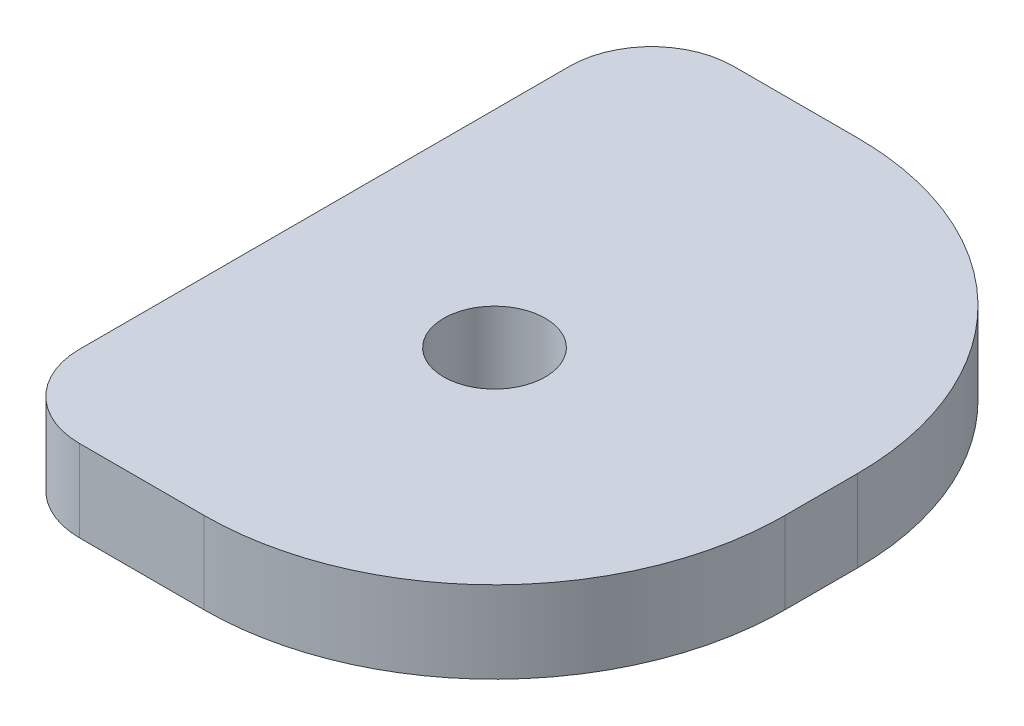
ISO-10303-21;
HEADER;
FILE_DESCRIPTION(('STEP AP214'),'2;1');
FILE_NAME('part.step','',(''),(''),'','','');
FILE_SCHEMA(('AUTOMOTIVE_DESIGN { 1 0 10303 214 1 1 1 1 }'));
ENDSEC;
DATA;
#1=APPLICATION_CONTEXT('core data for automotive mechanical design processes');
#2=APPLICATION_PROTOCOL_DEFINITION('international standard','automotive_design',2000,#1);
#3=PRODUCT_CONTEXT('',#1,'mechanical');
#4=PRODUCT('Part','Part','',(#3));
#5=PRODUCT_RELATED_PRODUCT_CATEGORY('part','',(#4));
#6=PRODUCT_DEFINITION_FORMATION('','',#4);
#7=PRODUCT_DEFINITION_CONTEXT('part definition',#1,'design');
#8=PRODUCT_DEFINITION('design','',#6,#7);
#9=PRODUCT_DEFINITION_SHAPE('','',#8);
#10=(LENGTH_UNIT() NAMED_UNIT(*) SI_UNIT(.MILLI.,.METRE.));
#11=(NAMED_UNIT(*) PLANE_ANGLE_UNIT() SI_UNIT($,.RADIAN.));
#12=(NAMED_UNIT(*) SI_UNIT($,.STERADIAN.) SOLID_ANGLE_UNIT());
#13=UNCERTAINTY_MEASURE_WITH_UNIT(LENGTH_MEASURE(1.E-05),#10,'distance_accuracy_value','');
#14=(GEOMETRIC_REPRESENTATION_CONTEXT(3) GLOBAL_UNCERTAINTY_ASSIGNED_CONTEXT((#13)) GLOBAL_UNIT_ASSIGNED_CONTEXT((#10,
#11,#12)) REPRESENTATION_CONTEXT('',''));
#15=CARTESIAN_POINT('',(0.,0.,0.));
#16=DIRECTION('',(0.,0.,1.));
#17=DIRECTION('',(1.,0.,0.));
#18=AXIS2_PLACEMENT_3D('',#15,#16,#17);
#19=CARTESIAN_POINT('',(-28.1821395804904,3.175,12.6899356487799));
#20=DIRECTION('',(0.,0.,-1.));
#21=DIRECTION('',(-1.,0.,0.));
#22=AXIS2_PLACEMENT_3D('',#19,#20,#21);
#23=PLANE('',#22);
#24=DIRECTION('',(1.,0.,0.));
#25=VECTOR('',#24,1.);
#26=CARTESIAN_POINT('',(-28.1821395804904,3.175,12.6899356487799));
#27=LINE('',#26,#25);
#28=CARTESIAN_POINT('',(12.1022604319399,3.175,12.6899356487799));
#29=VERTEX_POINT('',#28);
#30=CARTESIAN_POINT('',(16.9282604195096,3.175,12.6899356487799));
#31=VERTEX_POINT('',#30);
#32=EDGE_CURVE('E108',#29,#31,#27,.T.);
#33=ORIENTED_EDGE('',*,*,#32,.F.);
#34=DIRECTION('',(0.,1.,0.));
#35=VECTOR('',#34,1.);
#36=CARTESIAN_POINT('',(12.1022604319399,0.,12.6899356487799));
#37=LINE('',#36,#35);
#38=CARTESIAN_POINT('',(12.1022604319399,0.,12.6899356487799));
#39=VERTEX_POINT('',#38);
#40=EDGE_CURVE('E57',#29,#39,#37,.F.);
#41=ORIENTED_EDGE('',*,*,#40,.T.);
#42=DIRECTION('',(1.,0.,0.));
#43=VECTOR('',#42,1.);
#44=CARTESIAN_POINT('',(-28.1821395804904,0.,12.6899356487799));
#45=LINE('',#44,#43);
#46=CARTESIAN_POINT('',(16.9282604195096,0.,12.6899356487799));
#47=VERTEX_POINT('',#46);
#48=EDGE_CURVE('E151',#39,#47,#45,.T.);
#49=ORIENTED_EDGE('',*,*,#48,.T.);
#50=DIRECTION('',(0.,-1.,0.));
#51=VECTOR('',#50,1.);
#52=CARTESIAN_POINT('',(16.9282604195096,3.175,12.6899356487799));
#53=LINE('',#52,#51);
#54=EDGE_CURVE('E162',#47,#31,#53,.F.);
#55=ORIENTED_EDGE('',*,*,#54,.T.);
#56=EDGE_LOOP('',(#33,#41,#49,#55));
#57=FACE_BOUND('',#56,.T.);
#58=ADVANCED_FACE('F34',(#57),#23,.F.);
#59=CARTESIAN_POINT('',(-28.1821395804904,3.175,-12.6846643512201));
#60=DIRECTION('',(0.,0.,1.));
#61=DIRECTION('',(1.,0.,0.));
#62=AXIS2_PLACEMENT_3D('',#59,#60,#61);
#63=PLANE('',#62);
#64=DIRECTION('',(-1.,0.,0.));
#65=VECTOR('',#64,1.);
#66=CARTESIAN_POINT('',(-28.1821395804904,0.,-12.6846643512201));
#67=LINE('',#66,#65);
#68=CARTESIAN_POINT('',(16.9282604195096,0.,-12.6846643512201));
#69=VERTEX_POINT('',#68);
#70=CARTESIAN_POINT('',(12.1022604319399,0.,-12.6846643512201));
#71=VERTEX_POINT('',#70);
#72=EDGE_CURVE('E163',#69,#71,#67,.T.);
#73=ORIENTED_EDGE('',*,*,#72,.T.);
#74=DIRECTION('',(0.,1.,0.));
#75=VECTOR('',#74,1.);
#76=CARTESIAN_POINT('',(12.1022604319399,3.175,-12.6846643512201));
#77=LINE('',#76,#75);
#78=CARTESIAN_POINT('',(12.1022604319399,3.175,-12.6846643512201));
#79=VERTEX_POINT('',#78);
#80=EDGE_CURVE('E11',#71,#79,#77,.T.);
#81=ORIENTED_EDGE('',*,*,#80,.T.);
#82=DIRECTION('',(-1.,0.,0.));
#83=VECTOR('',#82,1.);
#84=CARTESIAN_POINT('',(-28.1821395804904,3.175,-12.6846643512201));
#85=LINE('',#84,#83);
#86=CARTESIAN_POINT('',(16.9282604195096,3.175,-12.6846643512201));
#87=VERTEX_POINT('',#86);
#88=EDGE_CURVE('E123',#87,#79,#85,.T.);
#89=ORIENTED_EDGE('',*,*,#88,.F.);
#90=DIRECTION('',(0.,-1.,0.));
#91=VECTOR('',#90,1.);
#92=CARTESIAN_POINT('',(16.9282604195096,3.175,-12.6846643512201));
#93=LINE('',#92,#91);
#94=EDGE_CURVE('E129',#87,#69,#93,.T.);
#95=ORIENTED_EDGE('',*,*,#94,.T.);
#96=EDGE_LOOP('',(#73,#81,#89,#95));
#97=FACE_BOUND('',#96,.T.);
#98=ADVANCED_FACE('F202',(#97),#63,.F.);
#99=CARTESIAN_POINT('',(0.0118604195095892,3.175,0.00263564877990878));
#100=DIRECTION('',(0.,1.,0.));
#101=DIRECTION('',(0.,0.,1.));
#102=AXIS2_PLACEMENT_3D('',#99,#100,#101);
#103=PLANE('',#102);
#104=CARTESIAN_POINT('',(16.9282604195096,3.175,1.41233564877991));
#105=DIRECTION('',(0.,1.,0.));
#106=DIRECTION('',(0.,0.,1.));
#107=AXIS2_PLACEMENT_3D('',#104,#105,#106);
#108=CIRCLE('',#107,1.97358);
#109=CARTESIAN_POINT('',(16.9282604195096,3.175,3.38591564877991));
#110=VERTEX_POINT('',#109);
#111=EDGE_CURVE('E158',#110,#110,#108,.T.);
#112=ORIENTED_EDGE('',*,*,#111,.F.);
#113=EDGE_LOOP('',(#112));
#114=FACE_BOUND('',#113,.T.);
#115=DIRECTION('',(0.,0.,1.));
#116=VECTOR('',#115,1.);
#117=CARTESIAN_POINT('',(8.92726043193989,3.175,-12.6846643512201));
#118=LINE('',#117,#116);
#119=CARTESIAN_POINT('',(8.92726043193989,3.175,-9.50966435122009));
#120=VERTEX_POINT('',#119);
#121=CARTESIAN_POINT('',(8.92726043193989,3.175,9.51493564877991));
#122=VERTEX_POINT('',#121);
#123=EDGE_CURVE('E159',#120,#122,#118,.T.);
#124=ORIENTED_EDGE('',*,*,#123,.T.);
#125=CARTESIAN_POINT('',(12.1022604319399,3.175,9.51493564877991));
#126=DIRECTION('',(0.,1.,0.));
#127=DIRECTION('',(0.,0.,1.));
#128=AXIS2_PLACEMENT_3D('',#125,#126,#127);
#129=CIRCLE('',#128,3.175);
#130=EDGE_CURVE('E144',#122,#29,#129,.T.);
#131=ORIENTED_EDGE('',*,*,#130,.T.);
#132=ORIENTED_EDGE('',*,*,#32,.T.);
#133=CARTESIAN_POINT('',(16.9282604195096,3.175,12.6899356487799));
#134=CARTESIAN_POINT('',(23.5345255484908,3.175,12.6899356487799));
#135=CARTESIAN_POINT('',(28.2058604195096,3.175,8.01860077776109));
#136=CARTESIAN_POINT('',(28.2058604195096,3.175,1.41233564877991));
#137=(BOUNDED_CURVE() B_SPLINE_CURVE(3,(#133,#134,#135,#136),.UNSPECIFIED.,.F.,
.F.) B_SPLINE_CURVE_WITH_KNOTS((4,4),(0.,1.),
.UNSPECIFIED.) CURVE() GEOMETRIC_REPRESENTATION_ITEM() RATIONAL_B_SPLINE_CURVE((1.,
0.804737854124365,0.804737854124365,1.)) REPRESENTATION_ITEM(''));
#138=CARTESIAN_POINT('',(28.2058604195096,3.175,1.41233564877991));
#139=VERTEX_POINT('',#138);
#140=EDGE_CURVE('E102',#31,#139,#137,.T.);
#141=ORIENTED_EDGE('',*,*,#140,.T.);
#142=DIRECTION('',(0.,0.,-1.));
#143=VECTOR('',#142,1.);
#144=CARTESIAN_POINT('',(28.2058604195096,3.175,-12.6846643512201));
#145=LINE('',#144,#143);
#146=CARTESIAN_POINT('',(28.2058604195096,3.175,-1.40706435122009));
#147=VERTEX_POINT('',#146);
#148=EDGE_CURVE('E106',#139,#147,#145,.T.);
#149=ORIENTED_EDGE('',*,*,#148,.T.);
#150=CARTESIAN_POINT('',(28.2058604195096,3.175,-1.40706435122009));
#151=CARTESIAN_POINT('',(28.2058604195096,3.175,-8.01332948020128));
#152=CARTESIAN_POINT('',(23.5345255484908,3.175,-12.6846643512201));
#153=CARTESIAN_POINT('',(16.9282604195096,3.175,-12.6846643512201));
#154=(BOUNDED_CURVE() B_SPLINE_CURVE(3,(#150,#151,#152,#153),.UNSPECIFIED.,.F.,
.F.) B_SPLINE_CURVE_WITH_KNOTS((4,4),(0.,1.),
.UNSPECIFIED.) CURVE() GEOMETRIC_REPRESENTATION_ITEM() RATIONAL_B_SPLINE_CURVE((1.,
0.804737854124365,0.804737854124365,1.)) REPRESENTATION_ITEM(''));
#155=EDGE_CURVE('E136',#147,#87,#154,.T.);
#156=ORIENTED_EDGE('',*,*,#155,.T.);
#157=ORIENTED_EDGE('',*,*,#88,.T.);
#158=CARTESIAN_POINT('',(12.1022604319399,3.175,-9.50966435122009));
#159=DIRECTION('',(0.,1.,0.));
#160=DIRECTION('',(0.,0.,1.));
#161=AXIS2_PLACEMENT_3D('',#158,#159,#160);
#162=CIRCLE('',#161,3.175);
#163=EDGE_CURVE('E142',#79,#120,#162,.T.);
#164=ORIENTED_EDGE('',*,*,#163,.T.);
#165=EDGE_LOOP('',(#124,#131,#132,#141,#149,#156,#157,#164));
#166=FACE_BOUND('',#165,.T.);
#167=ADVANCED_FACE('F105',(#114,#166),#103,.T.);
#168=CARTESIAN_POINT('',(0.0118604195095892,0.,0.00263564877990878));
#169=DIRECTION('',(0.,1.,0.));
#170=DIRECTION('',(0.,0.,1.));
#171=AXIS2_PLACEMENT_3D('',#168,#169,#170);
#172=PLANE('',#171);
#173=CARTESIAN_POINT('',(16.9282604195096,0.,1.41233564877991));
#174=DIRECTION('',(0.,1.,0.));
#175=DIRECTION('',(0.,0.,1.));
#176=AXIS2_PLACEMENT_3D('',#173,#174,#175);
#177=CIRCLE('',#176,1.97358);
#178=CARTESIAN_POINT('',(16.9282604195096,0.,3.38591564877991));
#179=VERTEX_POINT('',#178);
#180=EDGE_CURVE('E182',#179,#179,#177,.T.);
#181=ORIENTED_EDGE('',*,*,#180,.T.);
#182=EDGE_LOOP('',(#181));
#183=FACE_BOUND('',#182,.T.);
#184=ORIENTED_EDGE('',*,*,#48,.F.);
#185=CARTESIAN_POINT('',(12.1022604319399,0.,9.51493564877991));
#186=DIRECTION('',(0.,1.,0.));
#187=DIRECTION('',(0.,0.,1.));
#188=AXIS2_PLACEMENT_3D('',#185,#186,#187);
#189=CIRCLE('',#188,3.175);
#190=CARTESIAN_POINT('',(8.92726043193989,0.,9.51493564877991));
#191=VERTEX_POINT('',#190);
#192=EDGE_CURVE('E42',#39,#191,#189,.F.);
#193=ORIENTED_EDGE('',*,*,#192,.T.);
#194=DIRECTION('',(0.,0.,1.));
#195=VECTOR('',#194,1.);
#196=CARTESIAN_POINT('',(8.92726043193989,0.,-12.6846643512201));
#197=LINE('',#196,#195);
#198=CARTESIAN_POINT('',(8.92726043193989,0.,-9.50966435122009));
#199=VERTEX_POINT('',#198);
#200=EDGE_CURVE('E150',#199,#191,#197,.T.);
#201=ORIENTED_EDGE('',*,*,#200,.F.);
#202=CARTESIAN_POINT('',(12.1022604319399,0.,-9.50966435122009));
#203=DIRECTION('',(0.,1.,0.));
#204=DIRECTION('',(0.,0.,1.));
#205=AXIS2_PLACEMENT_3D('',#202,#203,#204);
#206=CIRCLE('',#205,3.175);
#207=EDGE_CURVE('E49',#199,#71,#206,.F.);
#208=ORIENTED_EDGE('',*,*,#207,.T.);
#209=ORIENTED_EDGE('',*,*,#72,.F.);
#210=CARTESIAN_POINT('',(28.2058604195096,0.,-1.40706435122009));
#211=CARTESIAN_POINT('',(28.2058604195096,0.,-8.01332948020128));
#212=CARTESIAN_POINT('',(23.5345255484908,0.,-12.6846643512201));
#213=CARTESIAN_POINT('',(16.9282604195096,0.,-12.6846643512201));
#214=(BOUNDED_CURVE() B_SPLINE_CURVE(3,(#210,#211,#212,#213),.UNSPECIFIED.,.F.,
.F.) B_SPLINE_CURVE_WITH_KNOTS((4,4),(0.,1.),
.UNSPECIFIED.) CURVE() GEOMETRIC_REPRESENTATION_ITEM() RATIONAL_B_SPLINE_CURVE((1.,
0.804737854124365,0.804737854124365,1.)) REPRESENTATION_ITEM(''));
#215=CARTESIAN_POINT('',(28.2058604195096,0.,-1.40706435122009));
#216=VERTEX_POINT('',#215);
#217=EDGE_CURVE('E127',#69,#216,#214,.F.);
#218=ORIENTED_EDGE('',*,*,#217,.T.);
#219=DIRECTION('',(0.,0.,-1.));
#220=VECTOR('',#219,1.);
#221=CARTESIAN_POINT('',(28.2058604195096,0.,-12.6846643512201));
#222=LINE('',#221,#220);
#223=CARTESIAN_POINT('',(28.2058604195096,0.,1.41233564877991));
#224=VERTEX_POINT('',#223);
#225=EDGE_CURVE('E165',#224,#216,#222,.T.);
#226=ORIENTED_EDGE('',*,*,#225,.F.);
#227=CARTESIAN_POINT('',(16.9282604195096,0.,12.6899356487799));
#228=CARTESIAN_POINT('',(23.5345255484908,0.,12.6899356487799));
#229=CARTESIAN_POINT('',(28.2058604195096,0.,8.01860077776109));
#230=CARTESIAN_POINT('',(28.2058604195096,0.,1.41233564877991));
#231=(BOUNDED_CURVE() B_SPLINE_CURVE(3,(#227,#228,#229,#230),.UNSPECIFIED.,.F.,
.F.) B_SPLINE_CURVE_WITH_KNOTS((4,4),(0.,1.),
.UNSPECIFIED.) CURVE() GEOMETRIC_REPRESENTATION_ITEM() RATIONAL_B_SPLINE_CURVE((1.,
0.804737854124365,0.804737854124365,1.)) REPRESENTATION_ITEM(''));
#232=EDGE_CURVE('E114',#224,#47,#231,.F.);
#233=ORIENTED_EDGE('',*,*,#232,.T.);
#234=EDGE_LOOP('',(#184,#193,#201,#208,#209,#218,#226,#233));
#235=FACE_BOUND('',#234,.T.);
#236=ADVANCED_FACE('F149',(#183,#235),#172,.F.);
#237=CARTESIAN_POINT('',(28.2058604195096,3.175,-12.6846643512201));
#238=DIRECTION('',(-1.,0.,0.));
#239=DIRECTION('',(0.,0.,1.));
#240=AXIS2_PLACEMENT_3D('',#237,#238,#239);
#241=PLANE('',#240);
#242=ORIENTED_EDGE('',*,*,#225,.T.);
#243=DIRECTION('',(0.,-1.,0.));
#244=VECTOR('',#243,1.);
#245=CARTESIAN_POINT('',(28.2058604195096,3.175,-1.40706435122009));
#246=LINE('',#245,#244);
#247=EDGE_CURVE('E122',#216,#147,#246,.F.);
#248=ORIENTED_EDGE('',*,*,#247,.T.);
#249=ORIENTED_EDGE('',*,*,#148,.F.);
#250=DIRECTION('',(0.,-1.,0.));
#251=VECTOR('',#250,1.);
#252=CARTESIAN_POINT('',(28.2058604195096,3.175,1.41233564877991));
#253=LINE('',#252,#251);
#254=EDGE_CURVE('E113',#139,#224,#253,.T.);
#255=ORIENTED_EDGE('',*,*,#254,.T.);
#256=EDGE_LOOP('',(#242,#248,#249,#255));
#257=FACE_BOUND('',#256,.T.);
#258=ADVANCED_FACE('F119',(#257),#241,.F.);
#259=CARTESIAN_POINT('',(16.9282604195096,3.175,1.41233564877991));
#260=DIRECTION('',(0.,-1.,0.));
#261=DIRECTION('',(0.,0.,-1.));
#262=AXIS2_PLACEMENT_3D('',#259,#260,#261);
#263=CYLINDRICAL_SURFACE('',#262,11.2776);
#264=ORIENTED_EDGE('',*,*,#140,.F.);
#265=ORIENTED_EDGE('',*,*,#54,.F.);
#266=ORIENTED_EDGE('',*,*,#232,.F.);
#267=ORIENTED_EDGE('',*,*,#254,.F.);
#268=EDGE_LOOP('',(#264,#265,#266,#267));
#269=FACE_BOUND('',#268,.T.);
#270=ADVANCED_FACE('F125',(#269),#263,.T.);
#271=CARTESIAN_POINT('',(16.9282604195096,0.,1.41233564877991));
#272=DIRECTION('',(0.,1.,0.));
#273=DIRECTION('',(0.,0.,1.));
#274=AXIS2_PLACEMENT_3D('',#271,#272,#273);
#275=CYLINDRICAL_SURFACE('',#274,1.97358);
#276=ORIENTED_EDGE('',*,*,#180,.F.);
#277=EDGE_LOOP('',(#276));
#278=FACE_BOUND('',#277,.T.);
#279=ORIENTED_EDGE('',*,*,#111,.T.);
#280=EDGE_LOOP('',(#279));
#281=FACE_BOUND('',#280,.T.);
#282=ADVANCED_FACE('F209',(#278,#281),#275,.F.);
#283=CARTESIAN_POINT('',(16.9282604195096,3.175,-1.40706435122009));
#284=DIRECTION('',(0.,-1.,0.));
#285=DIRECTION('',(0.,0.,-1.));
#286=AXIS2_PLACEMENT_3D('',#283,#284,#285);
#287=CYLINDRICAL_SURFACE('',#286,11.2776);
#288=ORIENTED_EDGE('',*,*,#155,.F.);
#289=ORIENTED_EDGE('',*,*,#247,.F.);
#290=ORIENTED_EDGE('',*,*,#217,.F.);
#291=ORIENTED_EDGE('',*,*,#94,.F.);
#292=EDGE_LOOP('',(#288,#289,#290,#291));
#293=FACE_BOUND('',#292,.T.);
#294=ADVANCED_FACE('F197',(#293),#287,.T.);
#295=CARTESIAN_POINT('',(8.92726043193989,0.,-12.6846643512201));
#296=DIRECTION('',(-1.,0.,0.));
#297=DIRECTION('',(0.,0.,1.));
#298=AXIS2_PLACEMENT_3D('',#295,#296,#297);
#299=PLANE('',#298);
#300=ORIENTED_EDGE('',*,*,#200,.T.);
#301=DIRECTION('',(0.,1.,0.));
#302=VECTOR('',#301,1.);
#303=CARTESIAN_POINT('',(8.92726043193989,3.175,9.51493564877991));
#304=LINE('',#303,#302);
#305=EDGE_CURVE('E139',#191,#122,#304,.T.);
#306=ORIENTED_EDGE('',*,*,#305,.T.);
#307=ORIENTED_EDGE('',*,*,#123,.F.);
#308=DIRECTION('',(0.,1.,0.));
#309=VECTOR('',#308,1.);
#310=CARTESIAN_POINT('',(8.92726043193989,0.,-9.50966435122009));
#311=LINE('',#310,#309);
#312=EDGE_CURVE('E137',#120,#199,#311,.F.);
#313=ORIENTED_EDGE('',*,*,#312,.T.);
#314=EDGE_LOOP('',(#300,#306,#307,#313));
#315=FACE_BOUND('',#314,.T.);
#316=ADVANCED_FACE('F155',(#315),#299,.T.);
#317=CARTESIAN_POINT('',(12.1022604319399,0.,9.51493564877991));
#318=DIRECTION('',(0.,-1.,0.));
#319=DIRECTION('',(0.,0.,-1.));
#320=AXIS2_PLACEMENT_3D('',#317,#318,#319);
#321=CYLINDRICAL_SURFACE('',#320,3.175);
#322=ORIENTED_EDGE('',*,*,#192,.F.);
#323=ORIENTED_EDGE('',*,*,#40,.F.);
#324=ORIENTED_EDGE('',*,*,#130,.F.);
#325=ORIENTED_EDGE('',*,*,#305,.F.);
#326=EDGE_LOOP('',(#322,#323,#324,#325));
#327=FACE_BOUND('',#326,.T.);
#328=ADVANCED_FACE('F161',(#327),#321,.T.);
#329=CARTESIAN_POINT('',(12.1022604319399,3.175,-9.50966435122009));
#330=DIRECTION('',(0.,-1.,0.));
#331=DIRECTION('',(0.,0.,-1.));
#332=AXIS2_PLACEMENT_3D('',#329,#330,#331);
#333=CYLINDRICAL_SURFACE('',#332,3.175);
#334=ORIENTED_EDGE('',*,*,#207,.F.);
#335=ORIENTED_EDGE('',*,*,#312,.F.);
#336=ORIENTED_EDGE('',*,*,#163,.F.);
#337=ORIENTED_EDGE('',*,*,#80,.F.);
#338=EDGE_LOOP('',(#334,#335,#336,#337));
#339=FACE_BOUND('',#338,.T.);
#340=ADVANCED_FACE('F36',(#339),#333,.T.);
#341=CLOSED_SHELL('',(#58,#98,#167,#236,#258,#270,#282,#294,#316,#328,#340));
#342=MANIFOLD_SOLID_BREP('B2',#341);
#343=ADVANCED_BREP_SHAPE_REPRESENTATION('',(#18,#342),#14);
#344=SHAPE_DEFINITION_REPRESENTATION(#9,#343);
ENDSEC;
END-ISO-10303-21;
